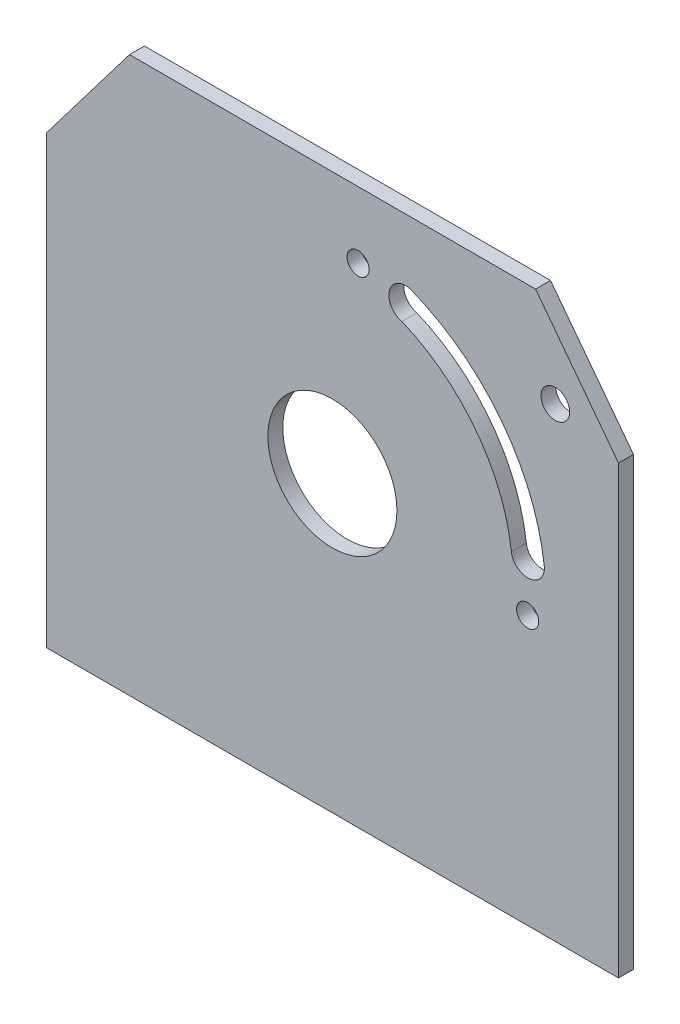
ISO-10303-21;
HEADER;
FILE_DESCRIPTION(('STEP AP214'),'2;1');
FILE_NAME('part.step','',(''),(''),'','','');
FILE_SCHEMA(('AUTOMOTIVE_DESIGN { 1 0 10303 214 1 1 1 1 }'));
ENDSEC;
DATA;
#1=APPLICATION_CONTEXT('core data for automotive mechanical design processes');
#2=APPLICATION_PROTOCOL_DEFINITION('international standard','automotive_design',2000,#1);
#3=PRODUCT_CONTEXT('',#1,'mechanical');
#4=PRODUCT('Part','Part','',(#3));
#5=PRODUCT_RELATED_PRODUCT_CATEGORY('part','',(#4));
#6=PRODUCT_DEFINITION_FORMATION('','',#4);
#7=PRODUCT_DEFINITION_CONTEXT('part definition',#1,'design');
#8=PRODUCT_DEFINITION('design','',#6,#7);
#9=PRODUCT_DEFINITION_SHAPE('','',#8);
#10=(LENGTH_UNIT() NAMED_UNIT(*) SI_UNIT(.MILLI.,.METRE.));
#11=(NAMED_UNIT(*) PLANE_ANGLE_UNIT() SI_UNIT($,.RADIAN.));
#12=(NAMED_UNIT(*) SI_UNIT($,.STERADIAN.) SOLID_ANGLE_UNIT());
#13=UNCERTAINTY_MEASURE_WITH_UNIT(LENGTH_MEASURE(1.E-05),#10,'distance_accuracy_value','');
#14=(GEOMETRIC_REPRESENTATION_CONTEXT(3) GLOBAL_UNCERTAINTY_ASSIGNED_CONTEXT((#13)) GLOBAL_UNIT_ASSIGNED_CONTEXT((#10,
#11,#12)) REPRESENTATION_CONTEXT('',''));
#15=CARTESIAN_POINT('',(0.,0.,0.));
#16=DIRECTION('',(0.,0.,1.));
#17=DIRECTION('',(1.,0.,0.));
#18=AXIS2_PLACEMENT_3D('',#15,#16,#17);
#19=CARTESIAN_POINT('',(-4.53865850270509,103.090232189093,3.302));
#20=DIRECTION('',(0.,0.,-1.));
#21=DIRECTION('',(-1.,0.,0.));
#22=AXIS2_PLACEMENT_3D('',#19,#20,#21);
#23=PLANE('',#22);
#24=CARTESIAN_POINT('',(64.386022104351,88.408658992849,3.302));
#25=DIRECTION('',(0.,0.,1.));
#26=DIRECTION('',(1.,0.,0.));
#27=AXIS2_PLACEMENT_3D('',#24,#25,#26);
#28=CIRCLE('',#27,2.44594381350452);
#29=CARTESIAN_POINT('',(66.8319659178556,88.408658992849,3.302));
#30=VERTEX_POINT('',#29);
#31=EDGE_CURVE('E137',#30,#30,#28,.T.);
#32=ORIENTED_EDGE('',*,*,#31,.F.);
#33=EDGE_LOOP('',(#32));
#34=FACE_BOUND('',#33,.T.);
#35=CARTESIAN_POINT('',(58.7102499448752,45.2839103709194,3.302));
#36=DIRECTION('',(0.,0.,1.));
#37=DIRECTION('',(1.,0.,0.));
#38=AXIS2_PLACEMENT_3D('',#35,#36,#37);
#39=CIRCLE('',#38,14.2801546214257);
#40=CARTESIAN_POINT('',(72.9904045663009,45.2839103709194,3.302));
#41=VERTEX_POINT('',#40);
#42=EDGE_CURVE('E147',#41,#41,#39,.T.);
#43=ORIENTED_EDGE('',*,*,#42,.F.);
#44=EDGE_LOOP('',(#43));
#45=FACE_BOUND('',#44,.T.);
#46=DIRECTION('',(0.,-1.,0.));
#47=VECTOR('',#46,1.);
#48=CARTESIAN_POINT('',(-4.5386585027051,-19.7472607340086,3.302));
#49=LINE('',#48,#47);
#50=CARTESIAN_POINT('',(-4.5386585027051,78.9321762768436,3.302));
#51=VERTEX_POINT('',#50);
#52=CARTESIAN_POINT('',(-4.5386585027051,-19.7472607340086,3.302));
#53=VERTEX_POINT('',#52);
#54=EDGE_CURVE('E159',#51,#53,#49,.T.);
#55=ORIENTED_EDGE('',*,*,#54,.T.);
#56=DIRECTION('',(1.,0.,0.));
#57=VECTOR('',#56,1.);
#58=CARTESIAN_POINT('',(-4.5386585027051,-19.7472607340086,3.302));
#59=LINE('',#58,#57);
#60=CARTESIAN_POINT('',(122.018241697402,-19.7472607340086,3.302));
#61=VERTEX_POINT('',#60);
#62=EDGE_CURVE('E162',#53,#61,#59,.T.);
#63=ORIENTED_EDGE('',*,*,#62,.T.);
#64=DIRECTION('',(0.,1.,0.));
#65=VECTOR('',#64,1.);
#66=CARTESIAN_POINT('',(122.018241697402,-19.7472607340086,3.302));
#67=LINE('',#66,#65);
#68=CARTESIAN_POINT('',(122.018241697402,78.9321762768436,3.302));
#69=VERTEX_POINT('',#68);
#70=EDGE_CURVE('E165',#61,#69,#67,.T.);
#71=ORIENTED_EDGE('',*,*,#70,.T.);
#72=DIRECTION('',(-0.604936983131272,0.796273349070553,0.));
#73=VECTOR('',#72,1.);
#74=CARTESIAN_POINT('',(122.018241697402,78.9321762768436,3.302));
#75=LINE('',#74,#73);
#76=CARTESIAN_POINT('',(103.665120273797,103.090232189093,3.302));
#77=VERTEX_POINT('',#76);
#78=EDGE_CURVE('E167',#69,#77,#75,.T.);
#79=ORIENTED_EDGE('',*,*,#78,.T.);
#80=DIRECTION('',(-1.,0.,0.));
#81=VECTOR('',#80,1.);
#82=CARTESIAN_POINT('',(13.8144629209003,103.090232189093,3.302));
#83=LINE('',#82,#81);
#84=CARTESIAN_POINT('',(13.8144629209003,103.090232189093,3.302));
#85=VERTEX_POINT('',#84);
#86=EDGE_CURVE('E169',#77,#85,#83,.T.);
#87=ORIENTED_EDGE('',*,*,#86,.T.);
#88=DIRECTION('',(-0.604936983131272,-0.796273349070553,0.));
#89=VECTOR('',#88,1.);
#90=CARTESIAN_POINT('',(-4.5386585027051,78.9321762768436,3.302));
#91=LINE('',#90,#89);
#92=EDGE_CURVE('E171',#85,#51,#91,.T.);
#93=ORIENTED_EDGE('',*,*,#92,.T.);
#94=EDGE_LOOP('',(#55,#63,#71,#79,#87,#93));
#95=FACE_BOUND('',#94,.T.);
#96=CARTESIAN_POINT('',(108.031447678437,83.2745987317091,3.302));
#97=DIRECTION('',(0.,0.,1.));
#98=DIRECTION('',(1.,0.,0.));
#99=AXIS2_PLACEMENT_3D('',#96,#97,#98);
#100=CIRCLE('',#99,3.175);
#101=CARTESIAN_POINT('',(111.206447678437,83.2745987317091,3.302));
#102=VERTEX_POINT('',#101);
#103=EDGE_CURVE('E153',#102,#102,#100,.T.);
#104=ORIENTED_EDGE('',*,*,#103,.F.);
#105=EDGE_LOOP('',(#104));
#106=FACE_BOUND('',#105,.T.);
#107=CARTESIAN_POINT('',(58.7102499448752,45.2839103709194,3.302));
#108=DIRECTION('',(0.,0.,-1.));
#109=DIRECTION('',(1.,0.,0.));
#110=AXIS2_PLACEMENT_3D('',#107,#108,#109);
#111=CIRCLE('',#110,39.8916687939744);
#112=CARTESIAN_POINT('',(74.070723533951,82.0996826742061,3.302));
#113=VERTEX_POINT('',#112);
#114=CARTESIAN_POINT('',(98.31150142406,50.0887121827027,3.302));
#115=VERTEX_POINT('',#114);
#116=EDGE_CURVE('E108',#113,#115,#111,.T.);
#117=ORIENTED_EDGE('',*,*,#116,.F.);
#118=CARTESIAN_POINT('',(74.8906557668307,85.6959061029263,3.302));
#119=DIRECTION('',(0.,0.,1.));
#120=DIRECTION('',(1.,0.,0.));
#121=AXIS2_PLACEMENT_3D('',#118,#119,#120);
#122=CIRCLE('',#121,3.68851078564109);
#123=CARTESIAN_POINT('',(76.2584574883382,89.1214323787606,3.302));
#124=VERTEX_POINT('',#123);
#125=EDGE_CURVE('E131',#124,#113,#122,.T.);
#126=ORIENTED_EDGE('',*,*,#125,.F.);
#127=CARTESIAN_POINT('',(58.7102499448752,45.2839103709194,3.302));
#128=DIRECTION('',(0.,0.,1.));
#129=DIRECTION('',(1.,0.,0.));
#130=AXIS2_PLACEMENT_3D('',#127,#128,#129);
#131=CIRCLE('',#130,47.2193596290379);
#132=CARTESIAN_POINT('',(105.584923306947,50.9789012379478,3.302));
#133=VERTEX_POINT('',#132);
#134=EDGE_CURVE('E129',#133,#124,#131,.T.);
#135=ORIENTED_EDGE('',*,*,#134,.F.);
#136=CARTESIAN_POINT('',(101.948212365503,50.5338067103253,3.302));
#137=DIRECTION('',(0.,0.,1.));
#138=DIRECTION('',(1.,0.,0.));
#139=AXIS2_PLACEMENT_3D('',#136,#137,#138);
#140=CIRCLE('',#139,3.66384710517959);
#141=EDGE_CURVE('E116',#115,#133,#140,.T.);
#142=ORIENTED_EDGE('',*,*,#141,.F.);
#143=EDGE_LOOP('',(#117,#126,#135,#142));
#144=FACE_BOUND('',#143,.T.);
#145=CARTESIAN_POINT('',(101.914361119273,39.6877037000921,3.302));
#146=DIRECTION('',(0.,0.,1.));
#147=DIRECTION('',(-1.,0.,0.));
#148=AXIS2_PLACEMENT_3D('',#145,#146,#147);
#149=CIRCLE('',#148,2.44594381350451);
#150=CARTESIAN_POINT('',(99.4684173057683,39.6877037000921,3.302));
#151=VERTEX_POINT('',#150);
#152=EDGE_CURVE('E276',#151,#151,#149,.T.);
#153=ORIENTED_EDGE('',*,*,#152,.F.);
#154=EDGE_LOOP('',(#153));
#155=FACE_BOUND('',#154,.T.);
#156=ADVANCED_FACE('F31',(#34,#45,#95,#106,#144,#155),#23,.F.);
#157=CARTESIAN_POINT('',(-4.53865850270509,103.090232189093,0.));
#158=DIRECTION('',(0.,0.,-1.));
#159=DIRECTION('',(-1.,0.,0.));
#160=AXIS2_PLACEMENT_3D('',#157,#158,#159);
#161=PLANE('',#160);
#162=CARTESIAN_POINT('',(64.386022104351,88.408658992849,0.));
#163=DIRECTION('',(0.,0.,1.));
#164=DIRECTION('',(1.,0.,0.));
#165=AXIS2_PLACEMENT_3D('',#162,#163,#164);
#166=CIRCLE('',#165,2.44594381350452);
#167=CARTESIAN_POINT('',(66.8319659178556,88.408658992849,0.));
#168=VERTEX_POINT('',#167);
#169=EDGE_CURVE('E282',#168,#168,#166,.T.);
#170=ORIENTED_EDGE('',*,*,#169,.T.);
#171=EDGE_LOOP('',(#170));
#172=FACE_BOUND('',#171,.T.);
#173=CARTESIAN_POINT('',(58.7102499448752,45.2839103709194,0.));
#174=DIRECTION('',(0.,0.,1.));
#175=DIRECTION('',(1.,0.,0.));
#176=AXIS2_PLACEMENT_3D('',#173,#174,#175);
#177=CIRCLE('',#176,14.2801546214257);
#178=CARTESIAN_POINT('',(72.9904045663009,45.2839103709194,0.));
#179=VERTEX_POINT('',#178);
#180=EDGE_CURVE('E124',#179,#179,#177,.T.);
#181=ORIENTED_EDGE('',*,*,#180,.T.);
#182=EDGE_LOOP('',(#181));
#183=FACE_BOUND('',#182,.T.);
#184=DIRECTION('',(0.,-1.,0.));
#185=VECTOR('',#184,1.);
#186=CARTESIAN_POINT('',(-4.5386585027051,-19.7472607340086,0.));
#187=LINE('',#186,#185);
#188=CARTESIAN_POINT('',(-4.5386585027051,78.9321762768436,0.));
#189=VERTEX_POINT('',#188);
#190=CARTESIAN_POINT('',(-4.5386585027051,-19.7472607340086,0.));
#191=VERTEX_POINT('',#190);
#192=EDGE_CURVE('E156',#189,#191,#187,.T.);
#193=ORIENTED_EDGE('',*,*,#192,.F.);
#194=DIRECTION('',(-0.604936983131272,-0.796273349070553,0.));
#195=VECTOR('',#194,1.);
#196=CARTESIAN_POINT('',(-4.5386585027051,78.9321762768436,0.));
#197=LINE('',#196,#195);
#198=CARTESIAN_POINT('',(13.8144629209003,103.090232189093,0.));
#199=VERTEX_POINT('',#198);
#200=EDGE_CURVE('E163',#199,#189,#197,.T.);
#201=ORIENTED_EDGE('',*,*,#200,.F.);
#202=DIRECTION('',(-1.,0.,0.));
#203=VECTOR('',#202,1.);
#204=CARTESIAN_POINT('',(13.8144629209003,103.090232189093,0.));
#205=LINE('',#204,#203);
#206=CARTESIAN_POINT('',(103.665120273797,103.090232189093,0.));
#207=VERTEX_POINT('',#206);
#208=EDGE_CURVE('E182',#207,#199,#205,.T.);
#209=ORIENTED_EDGE('',*,*,#208,.F.);
#210=DIRECTION('',(-0.604936983131272,0.796273349070553,0.));
#211=VECTOR('',#210,1.);
#212=CARTESIAN_POINT('',(122.018241697402,78.9321762768436,0.));
#213=LINE('',#212,#211);
#214=CARTESIAN_POINT('',(122.018241697402,78.9321762768436,0.));
#215=VERTEX_POINT('',#214);
#216=EDGE_CURVE('E180',#215,#207,#213,.T.);
#217=ORIENTED_EDGE('',*,*,#216,.F.);
#218=DIRECTION('',(0.,1.,0.));
#219=VECTOR('',#218,1.);
#220=CARTESIAN_POINT('',(122.018241697402,-19.7472607340086,0.));
#221=LINE('',#220,#219);
#222=CARTESIAN_POINT('',(122.018241697402,-19.7472607340086,0.));
#223=VERTEX_POINT('',#222);
#224=EDGE_CURVE('E178',#223,#215,#221,.T.);
#225=ORIENTED_EDGE('',*,*,#224,.F.);
#226=DIRECTION('',(1.,0.,0.));
#227=VECTOR('',#226,1.);
#228=CARTESIAN_POINT('',(-4.5386585027051,-19.7472607340086,0.));
#229=LINE('',#228,#227);
#230=EDGE_CURVE('E176',#191,#223,#229,.T.);
#231=ORIENTED_EDGE('',*,*,#230,.F.);
#232=EDGE_LOOP('',(#193,#201,#209,#217,#225,#231));
#233=FACE_BOUND('',#232,.T.);
#234=CARTESIAN_POINT('',(108.031447678437,83.2745987317091,0.));
#235=DIRECTION('',(0.,0.,1.));
#236=DIRECTION('',(1.,0.,0.));
#237=AXIS2_PLACEMENT_3D('',#234,#235,#236);
#238=CIRCLE('',#237,3.175);
#239=CARTESIAN_POINT('',(111.206447678437,83.2745987317091,0.));
#240=VERTEX_POINT('',#239);
#241=EDGE_CURVE('E150',#240,#240,#238,.T.);
#242=ORIENTED_EDGE('',*,*,#241,.T.);
#243=EDGE_LOOP('',(#242));
#244=FACE_BOUND('',#243,.T.);
#245=CARTESIAN_POINT('',(74.8906557668307,85.6959061029263,0.));
#246=DIRECTION('',(0.,0.,1.));
#247=DIRECTION('',(1.,0.,0.));
#248=AXIS2_PLACEMENT_3D('',#245,#246,#247);
#249=CIRCLE('',#248,3.68851078564109);
#250=CARTESIAN_POINT('',(76.2584574883382,89.1214323787606,0.));
#251=VERTEX_POINT('',#250);
#252=CARTESIAN_POINT('',(74.070723533951,82.0996826742061,0.));
#253=VERTEX_POINT('',#252);
#254=EDGE_CURVE('E117',#251,#253,#249,.T.);
#255=ORIENTED_EDGE('',*,*,#254,.T.);
#256=CARTESIAN_POINT('',(58.7102499448752,45.2839103709194,0.));
#257=DIRECTION('',(0.,0.,-1.));
#258=DIRECTION('',(1.,0.,0.));
#259=AXIS2_PLACEMENT_3D('',#256,#257,#258);
#260=CIRCLE('',#259,39.8916687939744);
#261=CARTESIAN_POINT('',(98.31150142406,50.0887121827027,0.));
#262=VERTEX_POINT('',#261);
#263=EDGE_CURVE('E54',#253,#262,#260,.T.);
#264=ORIENTED_EDGE('',*,*,#263,.T.);
#265=CARTESIAN_POINT('',(101.948212365503,50.5338067103253,0.));
#266=DIRECTION('',(0.,0.,1.));
#267=DIRECTION('',(1.,0.,0.));
#268=AXIS2_PLACEMENT_3D('',#265,#266,#267);
#269=CIRCLE('',#268,3.66384710517959);
#270=CARTESIAN_POINT('',(105.584923306947,50.9789012379478,0.));
#271=VERTEX_POINT('',#270);
#272=EDGE_CURVE('E123',#262,#271,#269,.T.);
#273=ORIENTED_EDGE('',*,*,#272,.T.);
#274=CARTESIAN_POINT('',(58.7102499448752,45.2839103709194,0.));
#275=DIRECTION('',(0.,0.,1.));
#276=DIRECTION('',(1.,0.,0.));
#277=AXIS2_PLACEMENT_3D('',#274,#275,#276);
#278=CIRCLE('',#277,47.2193596290379);
#279=EDGE_CURVE('E139',#271,#251,#278,.T.);
#280=ORIENTED_EDGE('',*,*,#279,.T.);
#281=EDGE_LOOP('',(#255,#264,#273,#280));
#282=FACE_BOUND('',#281,.T.);
#283=CARTESIAN_POINT('',(101.914361119273,39.6877037000921,0.));
#284=DIRECTION('',(0.,0.,1.));
#285=DIRECTION('',(-1.,0.,0.));
#286=AXIS2_PLACEMENT_3D('',#283,#284,#285);
#287=CIRCLE('',#286,2.44594381350451);
#288=CARTESIAN_POINT('',(99.4684173057683,39.6877037000921,0.));
#289=VERTEX_POINT('',#288);
#290=EDGE_CURVE('E279',#289,#289,#287,.T.);
#291=ORIENTED_EDGE('',*,*,#290,.T.);
#292=EDGE_LOOP('',(#291));
#293=FACE_BOUND('',#292,.T.);
#294=ADVANCED_FACE('F206',(#172,#183,#233,#244,#282,#293),#161,.T.);
#295=CARTESIAN_POINT('',(-4.5386585027051,-19.7472607340086,3.302));
#296=DIRECTION('',(1.,0.,0.));
#297=DIRECTION('',(0.,0.,-1.));
#298=AXIS2_PLACEMENT_3D('',#295,#296,#297);
#299=PLANE('',#298);
#300=ORIENTED_EDGE('',*,*,#192,.T.);
#301=DIRECTION('',(0.,0.,-1.));
#302=VECTOR('',#301,1.);
#303=CARTESIAN_POINT('',(-4.5386585027051,-19.7472607340086,3.302));
#304=LINE('',#303,#302);
#305=EDGE_CURVE('E11',#53,#191,#304,.T.);
#306=ORIENTED_EDGE('',*,*,#305,.F.);
#307=ORIENTED_EDGE('',*,*,#54,.F.);
#308=DIRECTION('',(0.,0.,-1.));
#309=VECTOR('',#308,1.);
#310=CARTESIAN_POINT('',(-4.5386585027051,78.9321762768436,3.302));
#311=LINE('',#310,#309);
#312=EDGE_CURVE('E173',#51,#189,#311,.T.);
#313=ORIENTED_EDGE('',*,*,#312,.T.);
#314=EDGE_LOOP('',(#300,#306,#307,#313));
#315=FACE_BOUND('',#314,.T.);
#316=ADVANCED_FACE('F33',(#315),#299,.F.);
#317=CARTESIAN_POINT('',(-4.5386585027051,-19.7472607340086,3.302));
#318=DIRECTION('',(0.,1.,0.));
#319=DIRECTION('',(0.,0.,1.));
#320=AXIS2_PLACEMENT_3D('',#317,#318,#319);
#321=PLANE('',#320);
#322=ORIENTED_EDGE('',*,*,#230,.T.);
#323=DIRECTION('',(0.,0.,-1.));
#324=VECTOR('',#323,1.);
#325=CARTESIAN_POINT('',(122.018241697402,-19.7472607340086,3.302));
#326=LINE('',#325,#324);
#327=EDGE_CURVE('E39',#61,#223,#326,.T.);
#328=ORIENTED_EDGE('',*,*,#327,.F.);
#329=ORIENTED_EDGE('',*,*,#62,.F.);
#330=ORIENTED_EDGE('',*,*,#305,.T.);
#331=EDGE_LOOP('',(#322,#328,#329,#330));
#332=FACE_BOUND('',#331,.T.);
#333=ADVANCED_FACE('F224',(#332),#321,.F.);
#334=CARTESIAN_POINT('',(122.018241697402,-19.7472607340086,3.302));
#335=DIRECTION('',(-1.,0.,0.));
#336=DIRECTION('',(0.,0.,1.));
#337=AXIS2_PLACEMENT_3D('',#334,#335,#336);
#338=PLANE('',#337);
#339=ORIENTED_EDGE('',*,*,#224,.T.);
#340=DIRECTION('',(0.,0.,-1.));
#341=VECTOR('',#340,1.);
#342=CARTESIAN_POINT('',(122.018241697402,78.9321762768436,3.302));
#343=LINE('',#342,#341);
#344=EDGE_CURVE('E193',#69,#215,#343,.T.);
#345=ORIENTED_EDGE('',*,*,#344,.F.);
#346=ORIENTED_EDGE('',*,*,#70,.F.);
#347=ORIENTED_EDGE('',*,*,#327,.T.);
#348=EDGE_LOOP('',(#339,#345,#346,#347));
#349=FACE_BOUND('',#348,.T.);
#350=ADVANCED_FACE('F200',(#349),#338,.F.);
#351=CARTESIAN_POINT('',(122.018241697402,78.9321762768436,3.302));
#352=DIRECTION('',(-0.796273349070553,-0.604936983131273,0.));
#353=DIRECTION('',(0.604936983131273,-0.796273349070553,0.));
#354=AXIS2_PLACEMENT_3D('',#351,#352,#353);
#355=PLANE('',#354);
#356=ORIENTED_EDGE('',*,*,#216,.T.);
#357=DIRECTION('',(0.,0.,-1.));
#358=VECTOR('',#357,1.);
#359=CARTESIAN_POINT('',(103.665120273797,103.090232189093,3.302));
#360=LINE('',#359,#358);
#361=EDGE_CURVE('E190',#77,#207,#360,.T.);
#362=ORIENTED_EDGE('',*,*,#361,.F.);
#363=ORIENTED_EDGE('',*,*,#78,.F.);
#364=ORIENTED_EDGE('',*,*,#344,.T.);
#365=EDGE_LOOP('',(#356,#362,#363,#364));
#366=FACE_BOUND('',#365,.T.);
#367=ADVANCED_FACE('F212',(#366),#355,.F.);
#368=CARTESIAN_POINT('',(13.8144629209003,103.090232189093,3.302));
#369=DIRECTION('',(0.,-1.,0.));
#370=DIRECTION('',(0.,0.,-1.));
#371=AXIS2_PLACEMENT_3D('',#368,#369,#370);
#372=PLANE('',#371);
#373=ORIENTED_EDGE('',*,*,#208,.T.);
#374=DIRECTION('',(0.,0.,-1.));
#375=VECTOR('',#374,1.);
#376=CARTESIAN_POINT('',(13.8144629209003,103.090232189093,3.302));
#377=LINE('',#376,#375);
#378=EDGE_CURVE('E187',#85,#199,#377,.T.);
#379=ORIENTED_EDGE('',*,*,#378,.F.);
#380=ORIENTED_EDGE('',*,*,#86,.F.);
#381=ORIENTED_EDGE('',*,*,#361,.T.);
#382=EDGE_LOOP('',(#373,#379,#380,#381));
#383=FACE_BOUND('',#382,.T.);
#384=ADVANCED_FACE('F216',(#383),#372,.F.);
#385=CARTESIAN_POINT('',(-4.5386585027051,78.9321762768436,3.302));
#386=DIRECTION('',(0.796273349070553,-0.604936983131273,0.));
#387=DIRECTION('',(0.604936983131273,0.796273349070553,0.));
#388=AXIS2_PLACEMENT_3D('',#385,#386,#387);
#389=PLANE('',#388);
#390=ORIENTED_EDGE('',*,*,#200,.T.);
#391=ORIENTED_EDGE('',*,*,#312,.F.);
#392=ORIENTED_EDGE('',*,*,#92,.F.);
#393=ORIENTED_EDGE('',*,*,#378,.T.);
#394=EDGE_LOOP('',(#390,#391,#392,#393));
#395=FACE_BOUND('',#394,.T.);
#396=ADVANCED_FACE('F227',(#395),#389,.F.);
#397=CARTESIAN_POINT('',(108.031447678437,83.2745987317091,3.302));
#398=DIRECTION('',(0.,0.,-1.));
#399=DIRECTION('',(-1.,0.,0.));
#400=AXIS2_PLACEMENT_3D('',#397,#398,#399);
#401=CYLINDRICAL_SURFACE('',#400,3.175);
#402=ORIENTED_EDGE('',*,*,#103,.T.);
#403=EDGE_LOOP('',(#402));
#404=FACE_BOUND('',#403,.T.);
#405=ORIENTED_EDGE('',*,*,#241,.F.);
#406=EDGE_LOOP('',(#405));
#407=FACE_BOUND('',#406,.T.);
#408=ADVANCED_FACE('F229',(#404,#407),#401,.F.);
#409=CARTESIAN_POINT('',(58.7102499448752,45.2839103709194,3.302));
#410=DIRECTION('',(0.,0.,-1.));
#411=DIRECTION('',(-1.,0.,0.));
#412=AXIS2_PLACEMENT_3D('',#409,#410,#411);
#413=CYLINDRICAL_SURFACE('',#412,14.2801546214257);
#414=ORIENTED_EDGE('',*,*,#42,.T.);
#415=EDGE_LOOP('',(#414));
#416=FACE_BOUND('',#415,.T.);
#417=ORIENTED_EDGE('',*,*,#180,.F.);
#418=EDGE_LOOP('',(#417));
#419=FACE_BOUND('',#418,.T.);
#420=ADVANCED_FACE('F235',(#416,#419),#413,.F.);
#421=CARTESIAN_POINT('',(58.7102499448752,45.2839103709194,3.302));
#422=DIRECTION('',(0.,0.,-1.));
#423=DIRECTION('',(-1.,0.,0.));
#424=AXIS2_PLACEMENT_3D('',#421,#422,#423);
#425=CYLINDRICAL_SURFACE('',#424,39.8916687939744);
#426=ORIENTED_EDGE('',*,*,#263,.F.);
#427=DIRECTION('',(0.,0.,-1.));
#428=VECTOR('',#427,1.);
#429=CARTESIAN_POINT('',(74.070723533951,82.0996826742061,3.302));
#430=LINE('',#429,#428);
#431=EDGE_CURVE('E112',#113,#253,#430,.T.);
#432=ORIENTED_EDGE('',*,*,#431,.F.);
#433=ORIENTED_EDGE('',*,*,#116,.T.);
#434=DIRECTION('',(0.,0.,-1.));
#435=VECTOR('',#434,1.);
#436=CARTESIAN_POINT('',(98.31150142406,50.0887121827027,3.302));
#437=LINE('',#436,#435);
#438=EDGE_CURVE('E111',#115,#262,#437,.T.);
#439=ORIENTED_EDGE('',*,*,#438,.T.);
#440=EDGE_LOOP('',(#426,#432,#433,#439));
#441=FACE_BOUND('',#440,.T.);
#442=ADVANCED_FACE('F110',(#441),#425,.T.);
#443=CARTESIAN_POINT('',(101.948212365503,50.5338067103253,3.302));
#444=DIRECTION('',(0.,0.,-1.));
#445=DIRECTION('',(-1.,0.,0.));
#446=AXIS2_PLACEMENT_3D('',#443,#444,#445);
#447=CYLINDRICAL_SURFACE('',#446,3.66384710517959);
#448=ORIENTED_EDGE('',*,*,#272,.F.);
#449=ORIENTED_EDGE('',*,*,#438,.F.);
#450=ORIENTED_EDGE('',*,*,#141,.T.);
#451=DIRECTION('',(0.,0.,-1.));
#452=VECTOR('',#451,1.);
#453=CARTESIAN_POINT('',(105.584923306947,50.9789012379478,3.302));
#454=LINE('',#453,#452);
#455=EDGE_CURVE('E125',#133,#271,#454,.T.);
#456=ORIENTED_EDGE('',*,*,#455,.T.);
#457=EDGE_LOOP('',(#448,#449,#450,#456));
#458=FACE_BOUND('',#457,.T.);
#459=ADVANCED_FACE('F120',(#458),#447,.F.);
#460=CARTESIAN_POINT('',(58.7102499448752,45.2839103709194,3.302));
#461=DIRECTION('',(0.,0.,-1.));
#462=DIRECTION('',(-1.,0.,0.));
#463=AXIS2_PLACEMENT_3D('',#460,#461,#462);
#464=CYLINDRICAL_SURFACE('',#463,47.2193596290379);
#465=ORIENTED_EDGE('',*,*,#279,.F.);
#466=ORIENTED_EDGE('',*,*,#455,.F.);
#467=ORIENTED_EDGE('',*,*,#134,.T.);
#468=DIRECTION('',(0.,0.,-1.));
#469=VECTOR('',#468,1.);
#470=CARTESIAN_POINT('',(76.2584574883382,89.1214323787606,3.302));
#471=LINE('',#470,#469);
#472=EDGE_CURVE('E46',#124,#251,#471,.T.);
#473=ORIENTED_EDGE('',*,*,#472,.T.);
#474=EDGE_LOOP('',(#465,#466,#467,#473));
#475=FACE_BOUND('',#474,.T.);
#476=ADVANCED_FACE('F257',(#475),#464,.F.);
#477=CARTESIAN_POINT('',(74.8906557668307,85.6959061029263,3.302));
#478=DIRECTION('',(0.,0.,-1.));
#479=DIRECTION('',(-1.,0.,0.));
#480=AXIS2_PLACEMENT_3D('',#477,#478,#479);
#481=CYLINDRICAL_SURFACE('',#480,3.68851078564109);
#482=ORIENTED_EDGE('',*,*,#254,.F.);
#483=ORIENTED_EDGE('',*,*,#472,.F.);
#484=ORIENTED_EDGE('',*,*,#125,.T.);
#485=ORIENTED_EDGE('',*,*,#431,.T.);
#486=EDGE_LOOP('',(#482,#483,#484,#485));
#487=FACE_BOUND('',#486,.T.);
#488=ADVANCED_FACE('F260',(#487),#481,.F.);
#489=CARTESIAN_POINT('',(64.386022104351,88.408658992849,3.302));
#490=DIRECTION('',(0.,0.,-1.));
#491=DIRECTION('',(-1.,0.,0.));
#492=AXIS2_PLACEMENT_3D('',#489,#490,#491);
#493=CYLINDRICAL_SURFACE('',#492,2.44594381350452);
#494=ORIENTED_EDGE('',*,*,#31,.T.);
#495=EDGE_LOOP('',(#494));
#496=FACE_BOUND('',#495,.T.);
#497=ORIENTED_EDGE('',*,*,#169,.F.);
#498=EDGE_LOOP('',(#497));
#499=FACE_BOUND('',#498,.T.);
#500=ADVANCED_FACE('F264',(#496,#499),#493,.F.);
#501=CARTESIAN_POINT('',(101.914361119273,39.6877037000921,3.302));
#502=DIRECTION('',(0.,0.,-1.));
#503=DIRECTION('',(-1.,0.,0.));
#504=AXIS2_PLACEMENT_3D('',#501,#502,#503);
#505=CYLINDRICAL_SURFACE('',#504,2.44594381350451);
#506=ORIENTED_EDGE('',*,*,#152,.T.);
#507=EDGE_LOOP('',(#506));
#508=FACE_BOUND('',#507,.T.);
#509=ORIENTED_EDGE('',*,*,#290,.F.);
#510=EDGE_LOOP('',(#509));
#511=FACE_BOUND('',#510,.T.);
#512=ADVANCED_FACE('F267',(#508,#511),#505,.F.);
#513=CLOSED_SHELL('',(#156,#294,#316,#333,#350,#367,#384,#396,#408,#420,#442,#459,#476,#488,
#500,#512));
#514=MANIFOLD_SOLID_BREP('B2',#513);
#515=ADVANCED_BREP_SHAPE_REPRESENTATION('',(#18,#514),#14);
#516=SHAPE_DEFINITION_REPRESENTATION(#9,#515);
ENDSEC;
END-ISO-10303-21;
